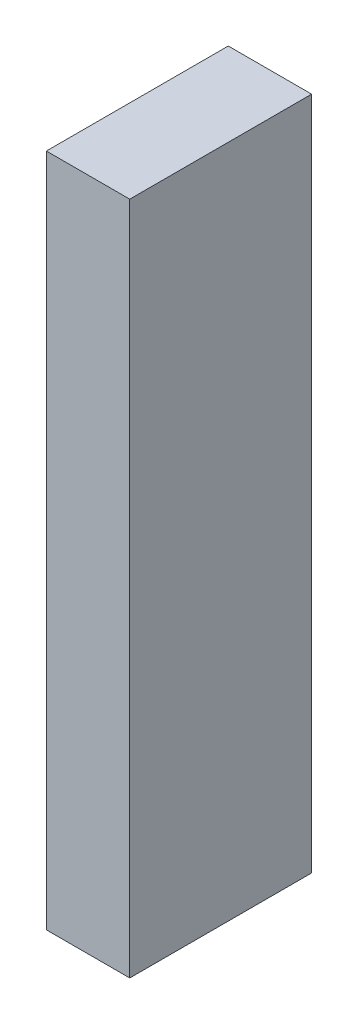
ISO-10303-21;
HEADER;
FILE_DESCRIPTION(('STEP AP214'),'2;1');
FILE_NAME('part.step','',(''),(''),'','','');
FILE_SCHEMA(('AUTOMOTIVE_DESIGN { 1 0 10303 214 1 1 1 1 }'));
ENDSEC;
DATA;
#1=APPLICATION_CONTEXT('core data for automotive mechanical design processes');
#2=APPLICATION_PROTOCOL_DEFINITION('international standard','automotive_design',2000,#1);
#3=PRODUCT_CONTEXT('',#1,'mechanical');
#4=PRODUCT('Part','Part','',(#3));
#5=PRODUCT_RELATED_PRODUCT_CATEGORY('part','',(#4));
#6=PRODUCT_DEFINITION_FORMATION('','',#4);
#7=PRODUCT_DEFINITION_CONTEXT('part definition',#1,'design');
#8=PRODUCT_DEFINITION('design','',#6,#7);
#9=PRODUCT_DEFINITION_SHAPE('','',#8);
#10=(LENGTH_UNIT() NAMED_UNIT(*) SI_UNIT(.MILLI.,.METRE.));
#11=(NAMED_UNIT(*) PLANE_ANGLE_UNIT() SI_UNIT($,.RADIAN.));
#12=(NAMED_UNIT(*) SI_UNIT($,.STERADIAN.) SOLID_ANGLE_UNIT());
#13=UNCERTAINTY_MEASURE_WITH_UNIT(LENGTH_MEASURE(1.E-05),#10,'distance_accuracy_value','');
#14=(GEOMETRIC_REPRESENTATION_CONTEXT(3) GLOBAL_UNCERTAINTY_ASSIGNED_CONTEXT((#13)) GLOBAL_UNIT_ASSIGNED_CONTEXT((#10,
#11,#12)) REPRESENTATION_CONTEXT('',''));
#15=CARTESIAN_POINT('',(0.,0.,0.));
#16=DIRECTION('',(0.,0.,1.));
#17=DIRECTION('',(1.,0.,0.));
#18=AXIS2_PLACEMENT_3D('',#15,#16,#17);
#19=CARTESIAN_POINT('',(22.,-0.01,48.01));
#20=DIRECTION('',(1.,0.,0.));
#21=DIRECTION('',(0.,0.,-1.));
#22=AXIS2_PLACEMENT_3D('',#19,#20,#21);
#23=PLANE('',#22);
#24=DIRECTION('',(0.,0.,-1.));
#25=VECTOR('',#24,1.);
#26=CARTESIAN_POINT('',(22.,178.,24.));
#27=LINE('',#26,#25);
#28=CARTESIAN_POINT('',(22.,178.,48.));
#29=VERTEX_POINT('',#28);
#30=CARTESIAN_POINT('',(22.,178.,0.));
#31=VERTEX_POINT('',#30);
#32=EDGE_CURVE('E69',#29,#31,#27,.T.);
#33=ORIENTED_EDGE('',*,*,#32,.F.);
#34=DIRECTION('',(0.,1.,0.));
#35=VECTOR('',#34,1.);
#36=CARTESIAN_POINT('',(22.,89.,48.));
#37=LINE('',#36,#35);
#38=CARTESIAN_POINT('',(22.,0.,48.));
#39=VERTEX_POINT('',#38);
#40=EDGE_CURVE('E56',#39,#29,#37,.T.);
#41=ORIENTED_EDGE('',*,*,#40,.F.);
#42=DIRECTION('',(0.,0.,1.));
#43=VECTOR('',#42,1.);
#44=CARTESIAN_POINT('',(22.,0.,24.));
#45=LINE('',#44,#43);
#46=CARTESIAN_POINT('',(22.,0.,0.));
#47=VERTEX_POINT('',#46);
#48=EDGE_CURVE('E21',#47,#39,#45,.T.);
#49=ORIENTED_EDGE('',*,*,#48,.F.);
#50=DIRECTION('',(0.,-1.,0.));
#51=VECTOR('',#50,1.);
#52=CARTESIAN_POINT('',(22.,89.,0.));
#53=LINE('',#52,#51);
#54=EDGE_CURVE('E82',#31,#47,#53,.T.);
#55=ORIENTED_EDGE('',*,*,#54,.F.);
#56=EDGE_LOOP('',(#33,#41,#49,#55));
#57=FACE_BOUND('',#56,.T.);
#58=ADVANCED_FACE('F17',(#57),#23,.T.);
#59=CARTESIAN_POINT('',(22.01,0.,48.01));
#60=DIRECTION('',(0.,-1.,0.));
#61=DIRECTION('',(-1.,0.,0.));
#62=AXIS2_PLACEMENT_3D('',#59,#60,#61);
#63=PLANE('',#62);
#64=DIRECTION('',(-1.,0.,0.));
#65=VECTOR('',#64,1.);
#66=CARTESIAN_POINT('',(11.,0.,0.));
#67=LINE('',#66,#65);
#68=CARTESIAN_POINT('',(0.,0.,0.));
#69=VERTEX_POINT('',#68);
#70=EDGE_CURVE('E65',#47,#69,#67,.T.);
#71=ORIENTED_EDGE('',*,*,#70,.F.);
#72=ORIENTED_EDGE('',*,*,#48,.T.);
#73=DIRECTION('',(1.,0.,0.));
#74=VECTOR('',#73,1.);
#75=CARTESIAN_POINT('',(11.,0.,48.));
#76=LINE('',#75,#74);
#77=CARTESIAN_POINT('',(0.,0.,48.));
#78=VERTEX_POINT('',#77);
#79=EDGE_CURVE('E62',#78,#39,#76,.T.);
#80=ORIENTED_EDGE('',*,*,#79,.F.);
#81=DIRECTION('',(0.,0.,1.));
#82=VECTOR('',#81,1.);
#83=CARTESIAN_POINT('',(0.,0.,24.));
#84=LINE('',#83,#82);
#85=EDGE_CURVE('E84',#69,#78,#84,.T.);
#86=ORIENTED_EDGE('',*,*,#85,.F.);
#87=EDGE_LOOP('',(#71,#72,#80,#86));
#88=FACE_BOUND('',#87,.T.);
#89=ADVANCED_FACE('F61',(#88),#63,.T.);
#90=CARTESIAN_POINT('',(-0.01,-0.01,48.));
#91=DIRECTION('',(0.,0.,1.));
#92=DIRECTION('',(1.,0.,0.));
#93=AXIS2_PLACEMENT_3D('',#90,#91,#92);
#94=PLANE('',#93);
#95=DIRECTION('',(1.,0.,0.));
#96=VECTOR('',#95,1.);
#97=CARTESIAN_POINT('',(11.,178.,48.));
#98=LINE('',#97,#96);
#99=CARTESIAN_POINT('',(0.,178.,48.));
#100=VERTEX_POINT('',#99);
#101=EDGE_CURVE('E71',#100,#29,#98,.T.);
#102=ORIENTED_EDGE('',*,*,#101,.F.);
#103=DIRECTION('',(0.,1.,0.));
#104=VECTOR('',#103,1.);
#105=CARTESIAN_POINT('',(0.,89.,48.));
#106=LINE('',#105,#104);
#107=EDGE_CURVE('E75',#78,#100,#106,.T.);
#108=ORIENTED_EDGE('',*,*,#107,.F.);
#109=ORIENTED_EDGE('',*,*,#79,.T.);
#110=ORIENTED_EDGE('',*,*,#40,.T.);
#111=EDGE_LOOP('',(#102,#108,#109,#110));
#112=FACE_BOUND('',#111,.T.);
#113=ADVANCED_FACE('F73',(#112),#94,.T.);
#114=CARTESIAN_POINT('',(-0.00999999999999891,178.,-0.00999999999999891));
#115=DIRECTION('',(0.,1.,0.));
#116=DIRECTION('',(0.,0.,1.));
#117=AXIS2_PLACEMENT_3D('',#114,#115,#116);
#118=PLANE('',#117);
#119=DIRECTION('',(1.,0.,0.));
#120=VECTOR('',#119,1.);
#121=CARTESIAN_POINT('',(11.,178.,0.));
#122=LINE('',#121,#120);
#123=CARTESIAN_POINT('',(0.,178.,0.));
#124=VERTEX_POINT('',#123);
#125=EDGE_CURVE('E36',#124,#31,#122,.T.);
#126=ORIENTED_EDGE('',*,*,#125,.F.);
#127=DIRECTION('',(0.,0.,-1.));
#128=VECTOR('',#127,1.);
#129=CARTESIAN_POINT('',(0.,178.,24.));
#130=LINE('',#129,#128);
#131=EDGE_CURVE('E27',#100,#124,#130,.T.);
#132=ORIENTED_EDGE('',*,*,#131,.F.);
#133=ORIENTED_EDGE('',*,*,#101,.T.);
#134=ORIENTED_EDGE('',*,*,#32,.T.);
#135=EDGE_LOOP('',(#126,#132,#133,#134));
#136=FACE_BOUND('',#135,.T.);
#137=ADVANCED_FACE('F89',(#136),#118,.T.);
#138=CARTESIAN_POINT('',(22.01,-0.01,0.));
#139=DIRECTION('',(0.,0.,-1.));
#140=DIRECTION('',(-1.,0.,0.));
#141=AXIS2_PLACEMENT_3D('',#138,#139,#140);
#142=PLANE('',#141);
#143=ORIENTED_EDGE('',*,*,#125,.T.);
#144=ORIENTED_EDGE('',*,*,#54,.T.);
#145=ORIENTED_EDGE('',*,*,#70,.T.);
#146=DIRECTION('',(0.,-1.,0.));
#147=VECTOR('',#146,1.);
#148=CARTESIAN_POINT('',(0.,89.,0.));
#149=LINE('',#148,#147);
#150=EDGE_CURVE('E11',#124,#69,#149,.T.);
#151=ORIENTED_EDGE('',*,*,#150,.F.);
#152=EDGE_LOOP('',(#143,#144,#145,#151));
#153=FACE_BOUND('',#152,.T.);
#154=ADVANCED_FACE('F91',(#153),#142,.T.);
#155=CARTESIAN_POINT('',(0.,-0.01,-0.01));
#156=DIRECTION('',(-1.,0.,0.));
#157=DIRECTION('',(0.,0.,1.));
#158=AXIS2_PLACEMENT_3D('',#155,#156,#157);
#159=PLANE('',#158);
#160=ORIENTED_EDGE('',*,*,#131,.T.);
#161=ORIENTED_EDGE('',*,*,#150,.T.);
#162=ORIENTED_EDGE('',*,*,#85,.T.);
#163=ORIENTED_EDGE('',*,*,#107,.T.);
#164=EDGE_LOOP('',(#160,#161,#162,#163));
#165=FACE_BOUND('',#164,.T.);
#166=ADVANCED_FACE('F19',(#165),#159,.T.);
#167=CLOSED_SHELL('',(#58,#89,#113,#137,#154,#166));
#168=MANIFOLD_SOLID_BREP('B1',#167);
#169=ADVANCED_BREP_SHAPE_REPRESENTATION('',(#18,#168),#14);
#170=SHAPE_DEFINITION_REPRESENTATION(#9,#169);
ENDSEC;
END-ISO-10303-21;
